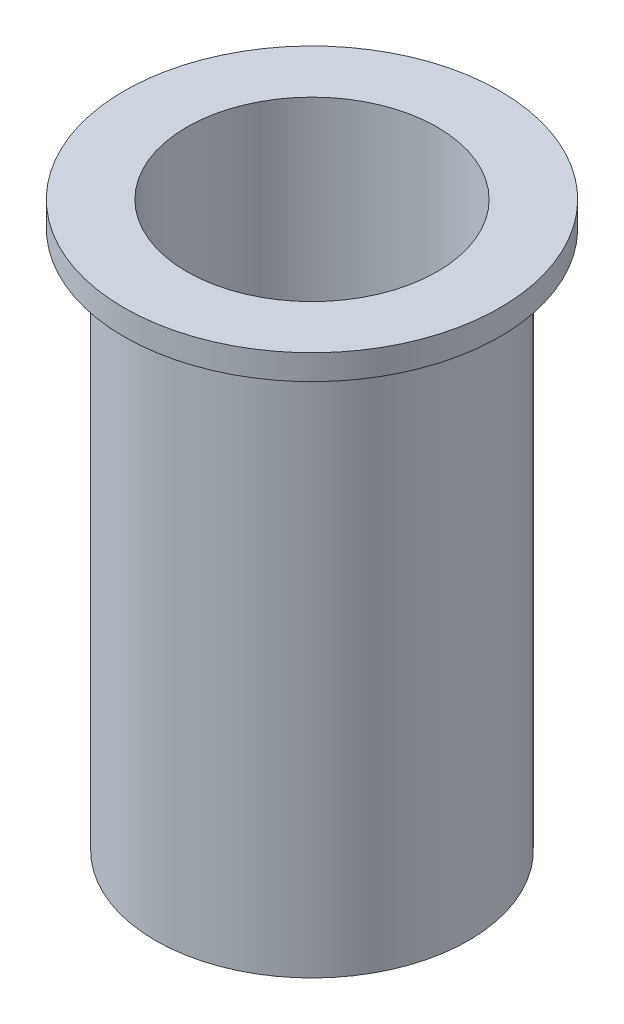
ISO-10303-21;
HEADER;
FILE_DESCRIPTION(('STEP AP214'),'2;1');
FILE_NAME('part.step','',(''),(''),'','','');
FILE_SCHEMA(('AUTOMOTIVE_DESIGN { 1 0 10303 214 1 1 1 1 }'));
ENDSEC;
DATA;
#1=APPLICATION_CONTEXT('core data for automotive mechanical design processes');
#2=APPLICATION_PROTOCOL_DEFINITION('international standard','automotive_design',2000,#1);
#3=PRODUCT_CONTEXT('',#1,'mechanical');
#4=PRODUCT('Part','Part','',(#3));
#5=PRODUCT_RELATED_PRODUCT_CATEGORY('part','',(#4));
#6=PRODUCT_DEFINITION_FORMATION('','',#4);
#7=PRODUCT_DEFINITION_CONTEXT('part definition',#1,'design');
#8=PRODUCT_DEFINITION('design','',#6,#7);
#9=PRODUCT_DEFINITION_SHAPE('','',#8);
#10=(LENGTH_UNIT() NAMED_UNIT(*) SI_UNIT(.MILLI.,.METRE.));
#11=(NAMED_UNIT(*) PLANE_ANGLE_UNIT() SI_UNIT($,.RADIAN.));
#12=(NAMED_UNIT(*) SI_UNIT($,.STERADIAN.) SOLID_ANGLE_UNIT());
#13=UNCERTAINTY_MEASURE_WITH_UNIT(LENGTH_MEASURE(1.E-05),#10,'distance_accuracy_value','');
#14=(GEOMETRIC_REPRESENTATION_CONTEXT(3) GLOBAL_UNCERTAINTY_ASSIGNED_CONTEXT((#13)) GLOBAL_UNIT_ASSIGNED_CONTEXT((#10,
#11,#12)) REPRESENTATION_CONTEXT('',''));
#15=CARTESIAN_POINT('',(0.,0.,0.));
#16=DIRECTION('',(0.,0.,1.));
#17=DIRECTION('',(1.,0.,0.));
#18=AXIS2_PLACEMENT_3D('',#15,#16,#17);
#19=CARTESIAN_POINT('',(0.,-0.4,0.));
#20=DIRECTION('',(0.,1.,0.));
#21=DIRECTION('',(0.,0.,1.));
#22=AXIS2_PLACEMENT_3D('',#19,#20,#21);
#23=CYLINDRICAL_SURFACE('',#22,3.);
#24=CARTESIAN_POINT('',(0.,-0.4,0.));
#25=DIRECTION('',(0.,1.,0.));
#26=DIRECTION('',(0.,0.,1.));
#27=AXIS2_PLACEMENT_3D('',#24,#25,#26);
#28=CIRCLE('',#27,3.);
#29=CARTESIAN_POINT('',(0.,-0.4,3.));
#30=VERTEX_POINT('',#29);
#31=EDGE_CURVE('E38',#30,#30,#28,.T.);
#32=ORIENTED_EDGE('',*,*,#31,.T.);
#33=EDGE_LOOP('',(#32));
#34=FACE_BOUND('',#33,.T.);
#35=CARTESIAN_POINT('',(0.,0.,0.));
#36=DIRECTION('',(0.,1.,0.));
#37=DIRECTION('',(0.,0.,1.));
#38=AXIS2_PLACEMENT_3D('',#35,#36,#37);
#39=CIRCLE('',#38,3.);
#40=CARTESIAN_POINT('',(0.,0.,3.));
#41=VERTEX_POINT('',#40);
#42=EDGE_CURVE('E34',#41,#41,#39,.T.);
#43=ORIENTED_EDGE('',*,*,#42,.F.);
#44=EDGE_LOOP('',(#43));
#45=FACE_BOUND('',#44,.T.);
#46=ADVANCED_FACE('F31',(#34,#45),#23,.T.);
#47=CARTESIAN_POINT('',(0.,-0.4,0.));
#48=DIRECTION('',(0.,1.,0.));
#49=DIRECTION('',(0.,0.,1.));
#50=AXIS2_PLACEMENT_3D('',#47,#48,#49);
#51=PLANE('',#50);
#52=CARTESIAN_POINT('',(0.,-0.4,0.));
#53=DIRECTION('',(0.,-1.,0.));
#54=DIRECTION('',(0.,0.,-1.));
#55=AXIS2_PLACEMENT_3D('',#52,#53,#54);
#56=CIRCLE('',#55,2.5);
#57=CARTESIAN_POINT('',(0.,-0.400000000000001,2.5));
#58=VERTEX_POINT('',#57);
#59=EDGE_CURVE('E10',#58,#58,#56,.T.);
#60=ORIENTED_EDGE('',*,*,#59,.F.);
#61=EDGE_LOOP('',(#60));
#62=FACE_BOUND('',#61,.T.);
#63=ORIENTED_EDGE('',*,*,#31,.F.);
#64=EDGE_LOOP('',(#63));
#65=FACE_BOUND('',#64,.T.);
#66=ADVANCED_FACE('F77',(#62,#65),#51,.F.);
#67=CARTESIAN_POINT('',(0.,0.,0.));
#68=DIRECTION('',(0.,1.,0.));
#69=DIRECTION('',(0.,0.,1.));
#70=AXIS2_PLACEMENT_3D('',#67,#68,#69);
#71=PLANE('',#70);
#72=CARTESIAN_POINT('',(0.,0.,0.));
#73=DIRECTION('',(0.,1.,0.));
#74=DIRECTION('',(0.,0.,1.));
#75=AXIS2_PLACEMENT_3D('',#72,#73,#74);
#76=CIRCLE('',#75,2.);
#77=CARTESIAN_POINT('',(0.,0.,2.));
#78=VERTEX_POINT('',#77);
#79=EDGE_CURVE('E47',#78,#78,#76,.F.);
#80=ORIENTED_EDGE('',*,*,#79,.T.);
#81=EDGE_LOOP('',(#80));
#82=FACE_BOUND('',#81,.T.);
#83=ORIENTED_EDGE('',*,*,#42,.T.);
#84=EDGE_LOOP('',(#83));
#85=FACE_BOUND('',#84,.T.);
#86=ADVANCED_FACE('F72',(#82,#85),#71,.T.);
#87=CARTESIAN_POINT('',(0.,-9.,0.));
#88=DIRECTION('',(0.,1.,0.));
#89=DIRECTION('',(0.,0.,1.));
#90=AXIS2_PLACEMENT_3D('',#87,#88,#89);
#91=CYLINDRICAL_SURFACE('',#90,2.5);
#92=CARTESIAN_POINT('',(0.,-9.,0.));
#93=DIRECTION('',(0.,-1.,0.));
#94=DIRECTION('',(0.,0.,-1.));
#95=AXIS2_PLACEMENT_3D('',#92,#93,#94);
#96=CIRCLE('',#95,2.5);
#97=CARTESIAN_POINT('',(0.,-9.,2.5));
#98=VERTEX_POINT('',#97);
#99=EDGE_CURVE('E44',#98,#98,#96,.T.);
#100=CARTESIAN_POINT('',(0.,-9.,2.5));
#101=CARTESIAN_POINT('',(0.,-8.91041666666666,2.5));
#102=CARTESIAN_POINT('',(0.,-8.82083333333333,2.5));
#103=CARTESIAN_POINT('',(0.,-8.64166666666666,2.5));
#104=CARTESIAN_POINT('',(0.,-8.55208333333333,2.5));
#105=CARTESIAN_POINT('',(0.,-8.37291666666666,2.5));
#106=CARTESIAN_POINT('',(0.,-8.28333333333333,2.5));
#107=CARTESIAN_POINT('',(0.,-8.10416666666666,2.5));
#108=CARTESIAN_POINT('',(0.,-8.01458333333333,2.5));
#109=CARTESIAN_POINT('',(0.,-7.83541666666666,2.5));
#110=CARTESIAN_POINT('',(0.,-7.74583333333333,2.5));
#111=CARTESIAN_POINT('',(0.,-7.56666666666667,2.5));
#112=CARTESIAN_POINT('',(0.,-7.47708333333333,2.5));
#113=CARTESIAN_POINT('',(0.,-7.29791666666666,2.5));
#114=CARTESIAN_POINT('',(0.,-7.20833333333333,2.5));
#115=CARTESIAN_POINT('',(0.,-7.02916666666667,2.5));
#116=CARTESIAN_POINT('',(0.,-6.93958333333333,2.5));
#117=CARTESIAN_POINT('',(0.,-6.76041666666667,2.5));
#118=CARTESIAN_POINT('',(0.,-6.67083333333333,2.5));
#119=CARTESIAN_POINT('',(0.,-6.49166666666667,2.5));
#120=CARTESIAN_POINT('',(0.,-6.40208333333333,2.5));
#121=CARTESIAN_POINT('',(0.,-6.22291666666667,2.5));
#122=CARTESIAN_POINT('',(0.,-6.13333333333333,2.5));
#123=CARTESIAN_POINT('',(0.,-5.95416666666667,2.5));
#124=CARTESIAN_POINT('',(0.,-5.86458333333333,2.5));
#125=CARTESIAN_POINT('',(0.,-5.68541666666667,2.5));
#126=CARTESIAN_POINT('',(0.,-5.59583333333333,2.5));
#127=CARTESIAN_POINT('',(0.,-5.41666666666667,2.5));
#128=CARTESIAN_POINT('',(0.,-5.32708333333333,2.5));
#129=CARTESIAN_POINT('',(0.,-5.14791666666667,2.5));
#130=CARTESIAN_POINT('',(0.,-5.05833333333333,2.5));
#131=CARTESIAN_POINT('',(0.,-4.87916666666667,2.5));
#132=CARTESIAN_POINT('',(0.,-4.78958333333333,2.5));
#133=CARTESIAN_POINT('',(0.,-4.61041666666667,2.5));
#134=CARTESIAN_POINT('',(0.,-4.52083333333333,2.5));
#135=CARTESIAN_POINT('',(0.,-4.34166666666667,2.5));
#136=CARTESIAN_POINT('',(0.,-4.25208333333333,2.5));
#137=CARTESIAN_POINT('',(0.,-4.07291666666667,2.5));
#138=CARTESIAN_POINT('',(0.,-3.98333333333333,2.5));
#139=CARTESIAN_POINT('',(0.,-3.80416666666667,2.5));
#140=CARTESIAN_POINT('',(0.,-3.71458333333333,2.5));
#141=CARTESIAN_POINT('',(0.,-3.53541666666667,2.5));
#142=CARTESIAN_POINT('',(0.,-3.44583333333333,2.5));
#143=CARTESIAN_POINT('',(0.,-3.26666666666667,2.5));
#144=CARTESIAN_POINT('',(0.,-3.17708333333333,2.5));
#145=CARTESIAN_POINT('',(0.,-2.99791666666667,2.5));
#146=CARTESIAN_POINT('',(0.,-2.90833333333333,2.5));
#147=CARTESIAN_POINT('',(0.,-2.72916666666667,2.5));
#148=CARTESIAN_POINT('',(0.,-2.63958333333333,2.5));
#149=CARTESIAN_POINT('',(0.,-2.46041666666667,2.5));
#150=CARTESIAN_POINT('',(0.,-2.37083333333333,2.5));
#151=CARTESIAN_POINT('',(0.,-2.19166666666667,2.5));
#152=CARTESIAN_POINT('',(0.,-2.10208333333333,2.5));
#153=CARTESIAN_POINT('',(0.,-1.92291666666667,2.5));
#154=CARTESIAN_POINT('',(0.,-1.83333333333333,2.5));
#155=CARTESIAN_POINT('',(0.,-1.65416666666667,2.5));
#156=CARTESIAN_POINT('',(0.,-1.56458333333333,2.5));
#157=CARTESIAN_POINT('',(0.,-1.38541666666667,2.5));
#158=CARTESIAN_POINT('',(0.,-1.29583333333333,2.5));
#159=CARTESIAN_POINT('',(0.,-1.11666666666667,2.5));
#160=CARTESIAN_POINT('',(0.,-1.02708333333333,2.5));
#161=CARTESIAN_POINT('',(0.,-0.847916666666668,2.5));
#162=CARTESIAN_POINT('',(0.,-0.758333333333334,2.5));
#163=CARTESIAN_POINT('',(0.,-0.579166666666668,2.5));
#164=CARTESIAN_POINT('',(0.,-0.489583333333334,2.5));
#165=CARTESIAN_POINT('',(0.,-0.400000000000001,2.5));
#166=B_SPLINE_CURVE_WITH_KNOTS('',3,(#100,#101,#102,#103,#104,#105,#106,#107,#108,#109,#110,
#111,#112,#113,#114,#115,#116,#117,#118,#119,#120,#121,#122,#123,#124,#125,#126,#127,#128,#129,
#130,#131,#132,#133,#134,#135,#136,#137,#138,#139,#140,#141,#142,#143,#144,#145,#146,#147,#148,
#149,#150,#151,#152,#153,#154,#155,#156,#157,#158,#159,#160,#161,#162,#163,#164,#165),
.UNSPECIFIED.,.F.,.F.,(4,2,2,2,2,2,2,2,2,2,2,2,2,2,2,2,2,2,2,2,2,2,2,2,2,2,2,2,2,2,2,2,4),(0.,
0.268750000000002,0.537500000000002,0.806250000000001,1.075,1.34375,1.6125,1.88125,2.15,2.41875,
2.6875,2.95625,3.225,3.49375,3.7625,4.03125,4.3,4.56875,4.8375,5.10625,5.375,5.64375,5.9125,
6.18125,6.45,6.71875,6.9875,7.25625,7.525,7.79375,8.0625,8.33125,8.6),.UNSPECIFIED.);
#167=EDGE_CURVE('BSEAM67',#98,#58,#166,.T.);
#168=ORIENTED_EDGE('',*,*,#99,.F.);
#169=ORIENTED_EDGE('',*,*,#59,.T.);
#170=ORIENTED_EDGE('',*,*,#167,.T.);
#171=ORIENTED_EDGE('',*,*,#167,.F.);
#172=EDGE_LOOP('',(#168,#170,#169,#171));
#173=FACE_BOUND('',#172,.T.);
#174=ADVANCED_FACE('F67',(#173),#91,.T.);
#175=CARTESIAN_POINT('',(0.,-9.,0.));
#176=DIRECTION('',(0.,-1.,0.));
#177=DIRECTION('',(0.,0.,-1.));
#178=AXIS2_PLACEMENT_3D('',#175,#176,#177);
#179=PLANE('',#178);
#180=CARTESIAN_POINT('',(0.,-9.,0.));
#181=DIRECTION('',(0.,-1.,0.));
#182=DIRECTION('',(0.,0.,-1.));
#183=AXIS2_PLACEMENT_3D('',#180,#181,#182);
#184=CIRCLE('',#183,1.5);
#185=CARTESIAN_POINT('',(0.,-9.,-1.5));
#186=VERTEX_POINT('',#185);
#187=EDGE_CURVE('E56',#186,#186,#184,.T.);
#188=ORIENTED_EDGE('',*,*,#187,.F.);
#189=EDGE_LOOP('',(#188));
#190=FACE_BOUND('',#189,.T.);
#191=ORIENTED_EDGE('',*,*,#99,.T.);
#192=EDGE_LOOP('',(#191));
#193=FACE_BOUND('',#192,.T.);
#194=ADVANCED_FACE('F63',(#190,#193),#179,.T.);
#195=CARTESIAN_POINT('',(0.,-9.,0.));
#196=DIRECTION('',(0.,1.,0.));
#197=DIRECTION('',(0.,0.,1.));
#198=AXIS2_PLACEMENT_3D('',#195,#196,#197);
#199=CYLINDRICAL_SURFACE('',#198,2.);
#200=CARTESIAN_POINT('',(0.,-8.5,0.));
#201=DIRECTION('',(0.,-1.,0.));
#202=DIRECTION('',(0.,0.,-1.));
#203=AXIS2_PLACEMENT_3D('',#200,#201,#202);
#204=CIRCLE('',#203,2.);
#205=CARTESIAN_POINT('',(0.,-8.5,2.));
#206=VERTEX_POINT('',#205);
#207=EDGE_CURVE('E50',#206,#206,#204,.T.);
#208=CARTESIAN_POINT('',(0.,-8.5,2.));
#209=CARTESIAN_POINT('',(0.,-8.41145833333333,2.));
#210=CARTESIAN_POINT('',(0.,-8.32291666666667,2.));
#211=CARTESIAN_POINT('',(0.,-8.14583333333333,2.));
#212=CARTESIAN_POINT('',(0.,-8.05729166666667,2.));
#213=CARTESIAN_POINT('',(0.,-7.88020833333333,2.));
#214=CARTESIAN_POINT('',(0.,-7.79166666666666,2.));
#215=CARTESIAN_POINT('',(0.,-7.61458333333333,2.));
#216=CARTESIAN_POINT('',(0.,-7.52604166666666,2.));
#217=CARTESIAN_POINT('',(0.,-7.34895833333333,2.));
#218=CARTESIAN_POINT('',(0.,-7.26041666666666,2.));
#219=CARTESIAN_POINT('',(0.,-7.08333333333333,2.));
#220=CARTESIAN_POINT('',(0.,-6.99479166666667,2.));
#221=CARTESIAN_POINT('',(0.,-6.81770833333333,2.));
#222=CARTESIAN_POINT('',(0.,-6.72916666666667,2.));
#223=CARTESIAN_POINT('',(0.,-6.55208333333333,2.));
#224=CARTESIAN_POINT('',(0.,-6.46354166666667,2.));
#225=CARTESIAN_POINT('',(0.,-6.28645833333333,2.));
#226=CARTESIAN_POINT('',(0.,-6.19791666666667,2.));
#227=CARTESIAN_POINT('',(0.,-6.02083333333333,2.));
#228=CARTESIAN_POINT('',(0.,-5.93229166666666,2.));
#229=CARTESIAN_POINT('',(0.,-5.75520833333333,2.));
#230=CARTESIAN_POINT('',(0.,-5.66666666666666,2.));
#231=CARTESIAN_POINT('',(0.,-5.48958333333333,2.));
#232=CARTESIAN_POINT('',(0.,-5.40104166666666,2.));
#233=CARTESIAN_POINT('',(0.,-5.22395833333333,2.));
#234=CARTESIAN_POINT('',(0.,-5.13541666666667,2.));
#235=CARTESIAN_POINT('',(0.,-4.95833333333333,2.));
#236=CARTESIAN_POINT('',(0.,-4.86979166666666,2.));
#237=CARTESIAN_POINT('',(0.,-4.69270833333333,2.));
#238=CARTESIAN_POINT('',(0.,-4.60416666666667,2.));
#239=CARTESIAN_POINT('',(0.,-4.42708333333333,2.));
#240=CARTESIAN_POINT('',(0.,-4.33854166666667,2.));
#241=CARTESIAN_POINT('',(0.,-4.16145833333333,2.));
#242=CARTESIAN_POINT('',(0.,-4.07291666666667,2.));
#243=CARTESIAN_POINT('',(0.,-3.89583333333333,2.));
#244=CARTESIAN_POINT('',(0.,-3.80729166666667,2.));
#245=CARTESIAN_POINT('',(0.,-3.63020833333333,2.));
#246=CARTESIAN_POINT('',(0.,-3.54166666666667,2.));
#247=CARTESIAN_POINT('',(0.,-3.36458333333333,2.));
#248=CARTESIAN_POINT('',(0.,-3.27604166666667,2.));
#249=CARTESIAN_POINT('',(0.,-3.09895833333333,2.));
#250=CARTESIAN_POINT('',(0.,-3.01041666666667,2.));
#251=CARTESIAN_POINT('',(0.,-2.83333333333333,2.));
#252=CARTESIAN_POINT('',(0.,-2.74479166666667,2.));
#253=CARTESIAN_POINT('',(0.,-2.56770833333333,2.));
#254=CARTESIAN_POINT('',(0.,-2.47916666666667,2.));
#255=CARTESIAN_POINT('',(0.,-2.30208333333333,2.));
#256=CARTESIAN_POINT('',(0.,-2.21354166666667,2.));
#257=CARTESIAN_POINT('',(0.,-2.03645833333333,2.));
#258=CARTESIAN_POINT('',(0.,-1.94791666666666,2.));
#259=CARTESIAN_POINT('',(0.,-1.77083333333333,2.));
#260=CARTESIAN_POINT('',(0.,-1.68229166666666,2.));
#261=CARTESIAN_POINT('',(0.,-1.50520833333333,2.));
#262=CARTESIAN_POINT('',(0.,-1.41666666666666,2.));
#263=CARTESIAN_POINT('',(0.,-1.23958333333333,2.));
#264=CARTESIAN_POINT('',(0.,-1.15104166666667,2.));
#265=CARTESIAN_POINT('',(0.,-0.973958333333332,2.));
#266=CARTESIAN_POINT('',(0.,-0.885416666666666,2.));
#267=CARTESIAN_POINT('',(0.,-0.708333333333333,2.));
#268=CARTESIAN_POINT('',(0.,-0.619791666666667,2.));
#269=CARTESIAN_POINT('',(0.,-0.442708333333333,2.));
#270=CARTESIAN_POINT('',(0.,-0.354166666666666,2.));
#271=CARTESIAN_POINT('',(0.,-0.177083333333332,2.));
#272=CARTESIAN_POINT('',(0.,-0.0885416666666662,2.));
#273=CARTESIAN_POINT('',(0.,0.,2.));
#274=B_SPLINE_CURVE_WITH_KNOTS('',3,(#208,#209,#210,#211,#212,#213,#214,#215,#216,#217,#218,
#219,#220,#221,#222,#223,#224,#225,#226,#227,#228,#229,#230,#231,#232,#233,#234,#235,#236,#237,
#238,#239,#240,#241,#242,#243,#244,#245,#246,#247,#248,#249,#250,#251,#252,#253,#254,#255,#256,
#257,#258,#259,#260,#261,#262,#263,#264,#265,#266,#267,#268,#269,#270,#271,#272,#273),
.UNSPECIFIED.,.F.,.F.,(4,2,2,2,2,2,2,2,2,2,2,2,2,2,2,2,2,2,2,2,2,2,2,2,2,2,2,2,2,2,2,2,4),(0.,
0.265625,0.53125,0.796875000000001,1.0625,1.328125,1.59375,1.859375,2.125,2.390625,2.65625,
2.921875,3.1875,3.453125,3.71875,3.984375,4.25,4.515625,4.78125,5.046875,5.3125,5.578125,
5.84375,6.109375,6.375,6.640625,6.90625,7.171875,7.4375,7.703125,7.96875,8.234375,8.5),.UNSPECIFIED.);
#275=EDGE_CURVE('BSEAM66',#206,#78,#274,.T.);
#276=ORIENTED_EDGE('',*,*,#207,.T.);
#277=ORIENTED_EDGE('',*,*,#79,.F.);
#278=ORIENTED_EDGE('',*,*,#275,.T.);
#279=ORIENTED_EDGE('',*,*,#275,.F.);
#280=EDGE_LOOP('',(#276,#278,#277,#279));
#281=FACE_BOUND('',#280,.T.);
#282=ADVANCED_FACE('F66',(#281),#199,.F.);
#283=CARTESIAN_POINT('',(0.,-8.5,0.));
#284=DIRECTION('',(0.,-1.,0.));
#285=DIRECTION('',(0.,0.,-1.));
#286=AXIS2_PLACEMENT_3D('',#283,#284,#285);
#287=PLANE('',#286);
#288=CARTESIAN_POINT('',(0.,-8.5,0.));
#289=DIRECTION('',(0.,-1.,0.));
#290=DIRECTION('',(0.,0.,-1.));
#291=AXIS2_PLACEMENT_3D('',#288,#289,#290);
#292=CIRCLE('',#291,1.5);
#293=CARTESIAN_POINT('',(0.,-8.5,-1.5));
#294=VERTEX_POINT('',#293);
#295=EDGE_CURVE('E53',#294,#294,#292,.F.);
#296=ORIENTED_EDGE('',*,*,#295,.F.);
#297=EDGE_LOOP('',(#296));
#298=FACE_BOUND('',#297,.T.);
#299=ORIENTED_EDGE('',*,*,#207,.F.);
#300=EDGE_LOOP('',(#299));
#301=FACE_BOUND('',#300,.T.);
#302=ADVANCED_FACE('F109',(#298,#301),#287,.F.);
#303=CARTESIAN_POINT('',(0.,0.000999999999999265,0.));
#304=DIRECTION('',(0.,-1.,0.));
#305=DIRECTION('',(0.,0.,-1.));
#306=AXIS2_PLACEMENT_3D('',#303,#304,#305);
#307=CYLINDRICAL_SURFACE('',#306,1.5);
#308=ORIENTED_EDGE('',*,*,#187,.T.);
#309=EDGE_LOOP('',(#308));
#310=FACE_BOUND('',#309,.T.);
#311=ORIENTED_EDGE('',*,*,#295,.T.);
#312=EDGE_LOOP('',(#311));
#313=FACE_BOUND('',#312,.T.);
#314=ADVANCED_FACE('F60',(#310,#313),#307,.F.);
#315=CLOSED_SHELL('',(#46,#66,#86,#174,#194,#282,#302,#314));
#316=MANIFOLD_SOLID_BREP('B2',#315);
#317=ADVANCED_BREP_SHAPE_REPRESENTATION('',(#18,#316),#14);
#318=SHAPE_DEFINITION_REPRESENTATION(#9,#317);
ENDSEC;
END-ISO-10303-21;
